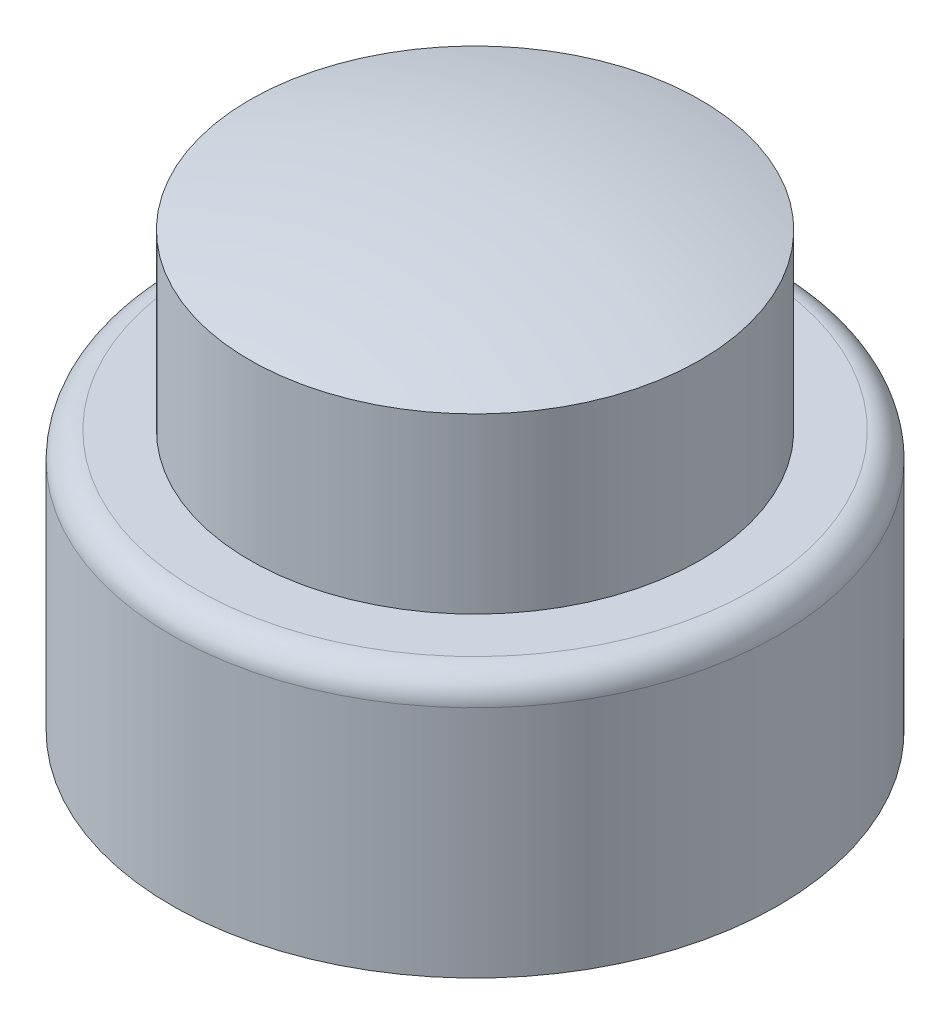
ISO-10303-21;
HEADER;
FILE_DESCRIPTION(('STEP AP214'),'2;1');
FILE_NAME('part.step','',(''),(''),'','','');
FILE_SCHEMA(('AUTOMOTIVE_DESIGN { 1 0 10303 214 1 1 1 1 }'));
ENDSEC;
DATA;
#1=APPLICATION_CONTEXT('core data for automotive mechanical design processes');
#2=APPLICATION_PROTOCOL_DEFINITION('international standard','automotive_design',2000,#1);
#3=PRODUCT_CONTEXT('',#1,'mechanical');
#4=PRODUCT('Part','Part','',(#3));
#5=PRODUCT_RELATED_PRODUCT_CATEGORY('part','',(#4));
#6=PRODUCT_DEFINITION_FORMATION('','',#4);
#7=PRODUCT_DEFINITION_CONTEXT('part definition',#1,'design');
#8=PRODUCT_DEFINITION('design','',#6,#7);
#9=PRODUCT_DEFINITION_SHAPE('','',#8);
#10=(LENGTH_UNIT() NAMED_UNIT(*) SI_UNIT(.MILLI.,.METRE.));
#11=(NAMED_UNIT(*) PLANE_ANGLE_UNIT() SI_UNIT($,.RADIAN.));
#12=(NAMED_UNIT(*) SI_UNIT($,.STERADIAN.) SOLID_ANGLE_UNIT());
#13=UNCERTAINTY_MEASURE_WITH_UNIT(LENGTH_MEASURE(1.E-05),#10,'distance_accuracy_value','');
#14=(GEOMETRIC_REPRESENTATION_CONTEXT(3) GLOBAL_UNCERTAINTY_ASSIGNED_CONTEXT((#13)) GLOBAL_UNIT_ASSIGNED_CONTEXT((#10,
#11,#12)) REPRESENTATION_CONTEXT('',''));
#15=CARTESIAN_POINT('',(0.,0.,0.));
#16=DIRECTION('',(0.,0.,1.));
#17=DIRECTION('',(1.,0.,0.));
#18=AXIS2_PLACEMENT_3D('',#15,#16,#17);
#19=CARTESIAN_POINT('',(0.,-2.32804308182932,0.));
#20=DIRECTION('',(0.,-1.,0.));
#21=DIRECTION('',(-1.,0.,0.));
#22=AXIS2_PLACEMENT_3D('',#19,#20,#21);
#23=SPHERICAL_SURFACE('',#22,5.);
#24=CARTESIAN_POINT('',(0.,2.5,0.));
#25=DIRECTION('',(0.,-1.,0.));
#26=DIRECTION('',(1.,0.,0.));
#27=AXIS2_PLACEMENT_3D('',#24,#25,#26);
#28=CIRCLE('',#27,1.3);
#29=CARTESIAN_POINT('',(1.3,2.5,0.));
#30=VERTEX_POINT('',#29);
#31=EDGE_CURVE('E42',#30,#30,#28,.T.);
#32=ORIENTED_EDGE('',*,*,#31,.F.);
#33=EDGE_LOOP('',(#32));
#34=FACE_BOUND('',#33,.T.);
#35=ADVANCED_FACE('F31',(#34),#23,.T.);
#36=CARTESIAN_POINT('',(0.,0.,0.));
#37=DIRECTION('',(0.,-1.,0.));
#38=DIRECTION('',(1.,0.,0.));
#39=AXIS2_PLACEMENT_3D('',#36,#37,#38);
#40=CYLINDRICAL_SURFACE('',#39,1.3);
#41=CARTESIAN_POINT('',(0.,1.5,0.));
#42=DIRECTION('',(0.,-1.,0.));
#43=DIRECTION('',(1.,0.,0.));
#44=AXIS2_PLACEMENT_3D('',#41,#42,#43);
#45=CIRCLE('',#44,1.3);
#46=CARTESIAN_POINT('',(1.3,1.5,0.));
#47=VERTEX_POINT('',#46);
#48=EDGE_CURVE('E46',#47,#47,#45,.T.);
#49=ORIENTED_EDGE('',*,*,#48,.F.);
#50=EDGE_LOOP('',(#49));
#51=FACE_BOUND('',#50,.T.);
#52=ORIENTED_EDGE('',*,*,#31,.T.);
#53=EDGE_LOOP('',(#52));
#54=FACE_BOUND('',#53,.T.);
#55=ADVANCED_FACE('F66',(#51,#54),#40,.T.);
#56=CARTESIAN_POINT('',(-1.3,1.5,0.));
#57=DIRECTION('',(0.,-1.,0.));
#58=DIRECTION('',(1.,0.,0.));
#59=AXIS2_PLACEMENT_3D('',#56,#57,#58);
#60=PLANE('',#59);
#61=CARTESIAN_POINT('',(0.,1.5,0.));
#62=DIRECTION('',(0.,-1.,0.));
#63=DIRECTION('',(1.,0.,0.));
#64=AXIS2_PLACEMENT_3D('',#61,#62,#63);
#65=CIRCLE('',#64,1.6);
#66=CARTESIAN_POINT('',(1.6,1.5,0.));
#67=VERTEX_POINT('',#66);
#68=EDGE_CURVE('E10',#67,#67,#65,.F.);
#69=ORIENTED_EDGE('',*,*,#68,.T.);
#70=EDGE_LOOP('',(#69));
#71=FACE_BOUND('',#70,.T.);
#72=ORIENTED_EDGE('',*,*,#48,.T.);
#73=EDGE_LOOP('',(#72));
#74=FACE_BOUND('',#73,.T.);
#75=ADVANCED_FACE('F59',(#71,#74),#60,.F.);
#76=CARTESIAN_POINT('',(0.,0.,0.));
#77=DIRECTION('',(0.,-1.,0.));
#78=DIRECTION('',(1.,0.,0.));
#79=AXIS2_PLACEMENT_3D('',#76,#77,#78);
#80=CYLINDRICAL_SURFACE('',#79,1.75);
#81=CARTESIAN_POINT('',(0.,1.35,0.));
#82=DIRECTION('',(0.,-1.,0.));
#83=DIRECTION('',(1.,0.,0.));
#84=AXIS2_PLACEMENT_3D('',#81,#82,#83);
#85=CIRCLE('',#84,1.75);
#86=CARTESIAN_POINT('',(1.75,1.35,0.));
#87=VERTEX_POINT('',#86);
#88=EDGE_CURVE('E38',#87,#87,#85,.T.);
#89=ORIENTED_EDGE('',*,*,#88,.T.);
#90=EDGE_LOOP('',(#89));
#91=FACE_BOUND('',#90,.T.);
#92=CARTESIAN_POINT('',(0.,0.,0.));
#93=DIRECTION('',(0.,-1.,0.));
#94=DIRECTION('',(1.,0.,0.));
#95=AXIS2_PLACEMENT_3D('',#92,#93,#94);
#96=CIRCLE('',#95,1.75);
#97=CARTESIAN_POINT('',(1.75,0.,0.));
#98=VERTEX_POINT('',#97);
#99=EDGE_CURVE('E51',#98,#98,#96,.T.);
#100=ORIENTED_EDGE('',*,*,#99,.F.);
#101=EDGE_LOOP('',(#100));
#102=FACE_BOUND('',#101,.T.);
#103=ADVANCED_FACE('F57',(#91,#102),#80,.T.);
#104=CARTESIAN_POINT('',(-1.75,0.,0.));
#105=DIRECTION('',(0.,1.,0.));
#106=DIRECTION('',(-1.,0.,0.));
#107=AXIS2_PLACEMENT_3D('',#104,#105,#106);
#108=PLANE('',#107);
#109=ORIENTED_EDGE('',*,*,#99,.T.);
#110=EDGE_LOOP('',(#109));
#111=FACE_BOUND('',#110,.T.);
#112=ADVANCED_FACE('F55',(#111),#108,.F.);
#113=CARTESIAN_POINT('',(0.,1.35,0.));
#114=DIRECTION('',(0.,-1.,0.));
#115=DIRECTION('',(1.,0.,0.));
#116=AXIS2_PLACEMENT_3D('',#113,#114,#115);
#117=TOROIDAL_SURFACE('',#116,1.6,0.15);
#118=ORIENTED_EDGE('',*,*,#68,.F.);
#119=EDGE_LOOP('',(#118));
#120=FACE_BOUND('',#119,.T.);
#121=ORIENTED_EDGE('',*,*,#88,.F.);
#122=EDGE_LOOP('',(#121));
#123=FACE_BOUND('',#122,.T.);
#124=ADVANCED_FACE('F33',(#120,#123),#117,.T.);
#125=CLOSED_SHELL('',(#35,#55,#75,#103,#112,#124));
#126=MANIFOLD_SOLID_BREP('B2',#125);
#127=ADVANCED_BREP_SHAPE_REPRESENTATION('',(#18,#126),#14);
#128=SHAPE_DEFINITION_REPRESENTATION(#9,#127);
ENDSEC;
END-ISO-10303-21;
